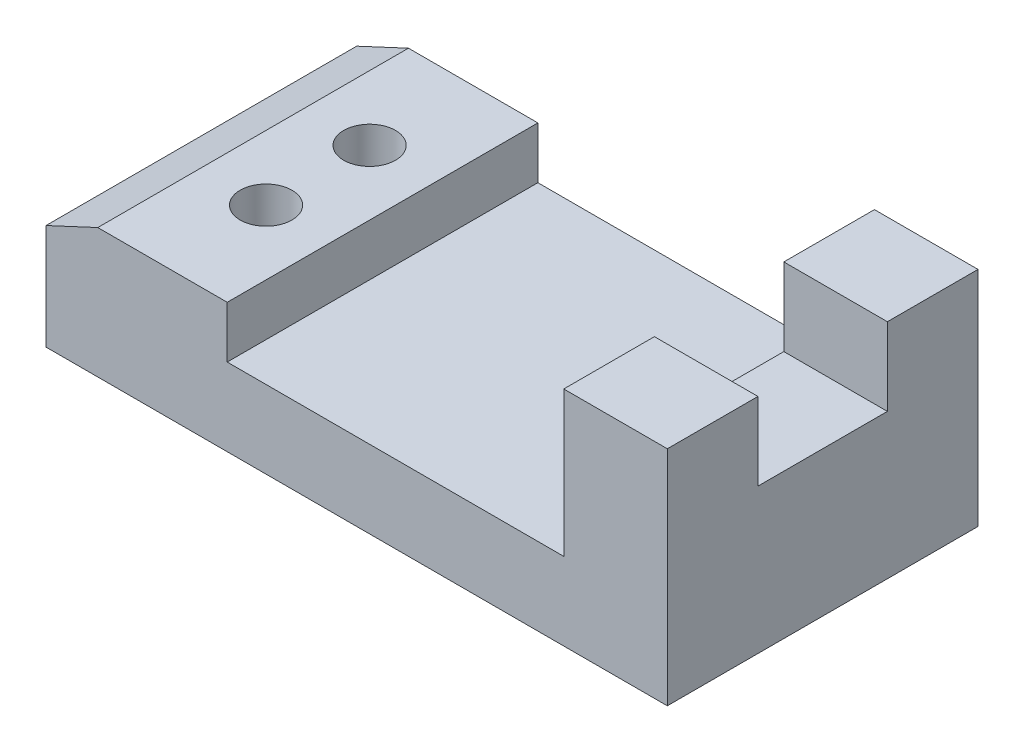
ISO-10303-21;
HEADER;
FILE_DESCRIPTION(('STEP AP214'),'2;1');
FILE_NAME('part.step','',(''),(''),'','','');
FILE_SCHEMA(('AUTOMOTIVE_DESIGN { 1 0 10303 214 1 1 1 1 }'));
ENDSEC;
DATA;
#1=APPLICATION_CONTEXT('core data for automotive mechanical design processes');
#2=APPLICATION_PROTOCOL_DEFINITION('international standard','automotive_design',2000,#1);
#3=PRODUCT_CONTEXT('',#1,'mechanical');
#4=PRODUCT('Part','Part','',(#3));
#5=PRODUCT_RELATED_PRODUCT_CATEGORY('part','',(#4));
#6=PRODUCT_DEFINITION_FORMATION('','',#4);
#7=PRODUCT_DEFINITION_CONTEXT('part definition',#1,'design');
#8=PRODUCT_DEFINITION('design','',#6,#7);
#9=PRODUCT_DEFINITION_SHAPE('','',#8);
#10=(LENGTH_UNIT() NAMED_UNIT(*) SI_UNIT(.MILLI.,.METRE.));
#11=(NAMED_UNIT(*) PLANE_ANGLE_UNIT() SI_UNIT($,.RADIAN.));
#12=(NAMED_UNIT(*) SI_UNIT($,.STERADIAN.) SOLID_ANGLE_UNIT());
#13=UNCERTAINTY_MEASURE_WITH_UNIT(LENGTH_MEASURE(1.E-05),#10,'distance_accuracy_value','');
#14=(GEOMETRIC_REPRESENTATION_CONTEXT(3) GLOBAL_UNCERTAINTY_ASSIGNED_CONTEXT((#13)) GLOBAL_UNIT_ASSIGNED_CONTEXT((#10,
#11,#12)) REPRESENTATION_CONTEXT('',''));
#15=CARTESIAN_POINT('',(0.,0.,0.));
#16=DIRECTION('',(0.,0.,1.));
#17=DIRECTION('',(1.,0.,0.));
#18=AXIS2_PLACEMENT_3D('',#15,#16,#17);
#19=CARTESIAN_POINT('',(120.,43.,60.));
#20=DIRECTION('',(0.,-1.,0.));
#21=DIRECTION('',(0.,0.,-1.));
#22=AXIS2_PLACEMENT_3D('',#19,#20,#21);
#23=PLANE('',#22);
#24=DIRECTION('',(0.,0.,-1.));
#25=VECTOR('',#24,1.);
#26=CARTESIAN_POINT('',(120.,43.,60.));
#27=LINE('',#26,#25);
#28=CARTESIAN_POINT('',(120.,43.,60.));
#29=VERTEX_POINT('',#28);
#30=CARTESIAN_POINT('',(120.,43.,42.5));
#31=VERTEX_POINT('',#30);
#32=EDGE_CURVE('E184',#29,#31,#27,.T.);
#33=ORIENTED_EDGE('',*,*,#32,.T.);
#34=DIRECTION('',(1.,0.,0.));
#35=VECTOR('',#34,1.);
#36=CARTESIAN_POINT('',(120.,43.,42.5));
#37=LINE('',#36,#35);
#38=CARTESIAN_POINT('',(100.,43.,42.5));
#39=VERTEX_POINT('',#38);
#40=EDGE_CURVE('E190',#39,#31,#37,.T.);
#41=ORIENTED_EDGE('',*,*,#40,.F.);
#42=DIRECTION('',(0.,0.,-1.));
#43=VECTOR('',#42,1.);
#44=CARTESIAN_POINT('',(100.,43.,60.));
#45=LINE('',#44,#43);
#46=CARTESIAN_POINT('',(100.,43.,60.));
#47=VERTEX_POINT('',#46);
#48=EDGE_CURVE('E180',#47,#39,#45,.T.);
#49=ORIENTED_EDGE('',*,*,#48,.F.);
#50=DIRECTION('',(-1.,0.,0.));
#51=VECTOR('',#50,1.);
#52=CARTESIAN_POINT('',(120.,43.,60.));
#53=LINE('',#52,#51);
#54=EDGE_CURVE('E230',#29,#47,#53,.T.);
#55=ORIENTED_EDGE('',*,*,#54,.F.);
#56=EDGE_LOOP('',(#33,#41,#49,#55));
#57=FACE_BOUND('',#56,.T.);
#58=ADVANCED_FACE('F35',(#57),#23,.F.);
#59=CARTESIAN_POINT('',(0.,0.,60.));
#60=DIRECTION('',(1.,0.,0.));
#61=DIRECTION('',(0.,0.,-1.));
#62=AXIS2_PLACEMENT_3D('',#59,#60,#61);
#63=PLANE('',#62);
#64=DIRECTION('',(0.,-1.,0.));
#65=VECTOR('',#64,1.);
#66=CARTESIAN_POINT('',(0.,0.,0.));
#67=LINE('',#66,#65);
#68=CARTESIAN_POINT('',(0.,20.3369234184501,0.));
#69=VERTEX_POINT('',#68);
#70=CARTESIAN_POINT('',(0.,0.,0.));
#71=VERTEX_POINT('',#70);
#72=EDGE_CURVE('E152',#69,#71,#67,.T.);
#73=ORIENTED_EDGE('',*,*,#72,.T.);
#74=DIRECTION('',(0.,0.,-1.));
#75=VECTOR('',#74,1.);
#76=CARTESIAN_POINT('',(0.,0.,60.));
#77=LINE('',#76,#75);
#78=CARTESIAN_POINT('',(0.,0.,60.));
#79=VERTEX_POINT('',#78);
#80=EDGE_CURVE('E11',#79,#71,#77,.T.);
#81=ORIENTED_EDGE('',*,*,#80,.F.);
#82=DIRECTION('',(0.,-1.,0.));
#83=VECTOR('',#82,1.);
#84=CARTESIAN_POINT('',(0.,0.,60.));
#85=LINE('',#84,#83);
#86=CARTESIAN_POINT('',(0.,20.3369234184501,60.));
#87=VERTEX_POINT('',#86);
#88=EDGE_CURVE('E172',#87,#79,#85,.T.);
#89=ORIENTED_EDGE('',*,*,#88,.F.);
#90=DIRECTION('',(0.,0.,-1.));
#91=VECTOR('',#90,1.);
#92=CARTESIAN_POINT('',(0.,20.3369234184501,60.));
#93=LINE('',#92,#91);
#94=EDGE_CURVE('E148',#87,#69,#93,.T.);
#95=ORIENTED_EDGE('',*,*,#94,.T.);
#96=EDGE_LOOP('',(#73,#81,#89,#95));
#97=FACE_BOUND('',#96,.T.);
#98=ADVANCED_FACE('F37',(#97),#63,.F.);
#99=CARTESIAN_POINT('',(0.,0.,60.));
#100=DIRECTION('',(0.,1.,0.));
#101=DIRECTION('',(0.,0.,1.));
#102=AXIS2_PLACEMENT_3D('',#99,#100,#101);
#103=PLANE('',#102);
#104=CARTESIAN_POINT('',(22.5,0.,20.));
#105=DIRECTION('',(0.,1.,0.));
#106=DIRECTION('',(-1.,0.,0.));
#107=AXIS2_PLACEMENT_3D('',#104,#105,#106);
#108=CIRCLE('',#107,5.);
#109=CARTESIAN_POINT('',(17.5,0.,20.));
#110=VERTEX_POINT('',#109);
#111=EDGE_CURVE('E202',#110,#110,#108,.T.);
#112=ORIENTED_EDGE('',*,*,#111,.T.);
#113=EDGE_LOOP('',(#112));
#114=FACE_BOUND('',#113,.T.);
#115=CARTESIAN_POINT('',(22.5,0.,40.));
#116=DIRECTION('',(0.,1.,0.));
#117=DIRECTION('',(-1.,0.,0.));
#118=AXIS2_PLACEMENT_3D('',#115,#116,#117);
#119=CIRCLE('',#118,5.);
#120=CARTESIAN_POINT('',(17.5,0.,40.));
#121=VERTEX_POINT('',#120);
#122=EDGE_CURVE('E191',#121,#121,#119,.T.);
#123=ORIENTED_EDGE('',*,*,#122,.T.);
#124=EDGE_LOOP('',(#123));
#125=FACE_BOUND('',#124,.T.);
#126=DIRECTION('',(1.,0.,0.));
#127=VECTOR('',#126,1.);
#128=CARTESIAN_POINT('',(0.,0.,0.));
#129=LINE('',#128,#127);
#130=CARTESIAN_POINT('',(120.,0.,0.));
#131=VERTEX_POINT('',#130);
#132=EDGE_CURVE('E155',#71,#131,#129,.T.);
#133=ORIENTED_EDGE('',*,*,#132,.T.);
#134=DIRECTION('',(0.,0.,-1.));
#135=VECTOR('',#134,1.);
#136=CARTESIAN_POINT('',(120.,0.,60.));
#137=LINE('',#136,#135);
#138=CARTESIAN_POINT('',(120.,0.,60.));
#139=VERTEX_POINT('',#138);
#140=EDGE_CURVE('E44',#139,#131,#137,.T.);
#141=ORIENTED_EDGE('',*,*,#140,.F.);
#142=DIRECTION('',(1.,0.,0.));
#143=VECTOR('',#142,1.);
#144=CARTESIAN_POINT('',(0.,0.,60.));
#145=LINE('',#144,#143);
#146=EDGE_CURVE('E105',#79,#139,#145,.T.);
#147=ORIENTED_EDGE('',*,*,#146,.F.);
#148=ORIENTED_EDGE('',*,*,#80,.T.);
#149=EDGE_LOOP('',(#133,#141,#147,#148));
#150=FACE_BOUND('',#149,.T.);
#151=ADVANCED_FACE('F252',(#114,#125,#150),#103,.F.);
#152=CARTESIAN_POINT('',(120.,0.,60.));
#153=DIRECTION('',(-1.,0.,0.));
#154=DIRECTION('',(0.,0.,1.));
#155=AXIS2_PLACEMENT_3D('',#152,#153,#154);
#156=PLANE('',#155);
#157=DIRECTION('',(0.,0.,-1.));
#158=VECTOR('',#157,1.);
#159=CARTESIAN_POINT('',(120.,28.,17.5));
#160=LINE('',#159,#158);
#161=CARTESIAN_POINT('',(120.,28.,42.5));
#162=VERTEX_POINT('',#161);
#163=CARTESIAN_POINT('',(120.,28.,17.5));
#164=VERTEX_POINT('',#163);
#165=EDGE_CURVE('E208',#162,#164,#160,.T.);
#166=ORIENTED_EDGE('',*,*,#165,.F.);
#167=DIRECTION('',(0.,1.,0.));
#168=VECTOR('',#167,1.);
#169=CARTESIAN_POINT('',(120.,28.,42.5));
#170=LINE('',#169,#168);
#171=EDGE_CURVE('E212',#162,#31,#170,.T.);
#172=ORIENTED_EDGE('',*,*,#171,.T.);
#173=ORIENTED_EDGE('',*,*,#32,.F.);
#174=DIRECTION('',(0.,1.,0.));
#175=VECTOR('',#174,1.);
#176=CARTESIAN_POINT('',(120.,0.,60.));
#177=LINE('',#176,#175);
#178=EDGE_CURVE('E228',#139,#29,#177,.T.);
#179=ORIENTED_EDGE('',*,*,#178,.F.);
#180=ORIENTED_EDGE('',*,*,#140,.T.);
#181=DIRECTION('',(0.,1.,0.));
#182=VECTOR('',#181,1.);
#183=CARTESIAN_POINT('',(120.,0.,0.));
#184=LINE('',#183,#182);
#185=CARTESIAN_POINT('',(120.,43.,0.));
#186=VERTEX_POINT('',#185);
#187=EDGE_CURVE('E158',#131,#186,#184,.T.);
#188=ORIENTED_EDGE('',*,*,#187,.T.);
#189=CARTESIAN_POINT('',(120.,43.,17.5));
#190=VERTEX_POINT('',#189);
#191=EDGE_CURVE('E183',#190,#186,#27,.T.);
#192=ORIENTED_EDGE('',*,*,#191,.F.);
#193=DIRECTION('',(0.,1.,0.));
#194=VECTOR('',#193,1.);
#195=CARTESIAN_POINT('',(120.,28.,17.5));
#196=LINE('',#195,#194);
#197=EDGE_CURVE('E221',#164,#190,#196,.T.);
#198=ORIENTED_EDGE('',*,*,#197,.F.);
#199=EDGE_LOOP('',(#166,#172,#173,#179,#180,#188,#192,#198));
#200=FACE_BOUND('',#199,.T.);
#201=ADVANCED_FACE('F256',(#200),#156,.F.);
#202=CARTESIAN_POINT('',(100.,43.,17.5));
#203=VERTEX_POINT('',#202);
#204=CARTESIAN_POINT('',(100.,43.,0.));
#205=VERTEX_POINT('',#204);
#206=EDGE_CURVE('E179',#203,#205,#45,.T.);
#207=ORIENTED_EDGE('',*,*,#206,.F.);
#208=DIRECTION('',(-1.,0.,0.));
#209=VECTOR('',#208,1.);
#210=CARTESIAN_POINT('',(100.,43.,17.5));
#211=LINE('',#210,#209);
#212=EDGE_CURVE('E195',#190,#203,#211,.T.);
#213=ORIENTED_EDGE('',*,*,#212,.F.);
#214=ORIENTED_EDGE('',*,*,#191,.T.);
#215=DIRECTION('',(-1.,0.,0.));
#216=VECTOR('',#215,1.);
#217=CARTESIAN_POINT('',(120.,43.,0.));
#218=LINE('',#217,#216);
#219=EDGE_CURVE('E161',#186,#205,#218,.T.);
#220=ORIENTED_EDGE('',*,*,#219,.T.);
#221=EDGE_LOOP('',(#207,#213,#214,#220));
#222=FACE_BOUND('',#221,.T.);
#223=ADVANCED_FACE('F283',(#222),#23,.F.);
#224=CARTESIAN_POINT('',(100.,43.,60.));
#225=DIRECTION('',(1.,0.,0.));
#226=DIRECTION('',(0.,0.,-1.));
#227=AXIS2_PLACEMENT_3D('',#224,#225,#226);
#228=PLANE('',#227);
#229=ORIENTED_EDGE('',*,*,#48,.T.);
#230=DIRECTION('',(0.,1.,0.));
#231=VECTOR('',#230,1.);
#232=CARTESIAN_POINT('',(100.,28.,42.5));
#233=LINE('',#232,#231);
#234=CARTESIAN_POINT('',(100.,28.,42.5));
#235=VERTEX_POINT('',#234);
#236=EDGE_CURVE('E156',#235,#39,#233,.T.);
#237=ORIENTED_EDGE('',*,*,#236,.F.);
#238=DIRECTION('',(0.,0.,1.));
#239=VECTOR('',#238,1.);
#240=CARTESIAN_POINT('',(100.,28.,42.5));
#241=LINE('',#240,#239);
#242=CARTESIAN_POINT('',(100.,28.,17.5));
#243=VERTEX_POINT('',#242);
#244=EDGE_CURVE('E211',#243,#235,#241,.T.);
#245=ORIENTED_EDGE('',*,*,#244,.F.);
#246=DIRECTION('',(0.,1.,0.));
#247=VECTOR('',#246,1.);
#248=CARTESIAN_POINT('',(100.,28.,17.5));
#249=LINE('',#248,#247);
#250=EDGE_CURVE('E218',#243,#203,#249,.T.);
#251=ORIENTED_EDGE('',*,*,#250,.T.);
#252=ORIENTED_EDGE('',*,*,#206,.T.);
#253=DIRECTION('',(0.,-1.,0.));
#254=VECTOR('',#253,1.);
#255=CARTESIAN_POINT('',(100.,43.,0.));
#256=LINE('',#255,#254);
#257=CARTESIAN_POINT('',(100.,15.,0.));
#258=VERTEX_POINT('',#257);
#259=EDGE_CURVE('E164',#205,#258,#256,.T.);
#260=ORIENTED_EDGE('',*,*,#259,.T.);
#261=DIRECTION('',(0.,0.,-1.));
#262=VECTOR('',#261,1.);
#263=CARTESIAN_POINT('',(100.,15.,60.));
#264=LINE('',#263,#262);
#265=CARTESIAN_POINT('',(100.,15.,60.));
#266=VERTEX_POINT('',#265);
#267=EDGE_CURVE('E176',#266,#258,#264,.T.);
#268=ORIENTED_EDGE('',*,*,#267,.F.);
#269=DIRECTION('',(0.,-1.,0.));
#270=VECTOR('',#269,1.);
#271=CARTESIAN_POINT('',(100.,43.,60.));
#272=LINE('',#271,#270);
#273=EDGE_CURVE('E232',#47,#266,#272,.T.);
#274=ORIENTED_EDGE('',*,*,#273,.F.);
#275=EDGE_LOOP('',(#229,#237,#245,#251,#252,#260,#268,#274));
#276=FACE_BOUND('',#275,.T.);
#277=ADVANCED_FACE('F238',(#276),#228,.F.);
#278=CARTESIAN_POINT('',(100.,15.,60.));
#279=DIRECTION('',(0.,-1.,0.));
#280=DIRECTION('',(1.,0.,0.));
#281=AXIS2_PLACEMENT_3D('',#278,#279,#280);
#282=PLANE('',#281);
#283=DIRECTION('',(-1.,0.,0.));
#284=VECTOR('',#283,1.);
#285=CARTESIAN_POINT('',(100.,15.,0.));
#286=LINE('',#285,#284);
#287=CARTESIAN_POINT('',(35.,15.,0.));
#288=VERTEX_POINT('',#287);
#289=EDGE_CURVE('E166',#258,#288,#286,.T.);
#290=ORIENTED_EDGE('',*,*,#289,.T.);
#291=DIRECTION('',(0.,0.,-1.));
#292=VECTOR('',#291,1.);
#293=CARTESIAN_POINT('',(35.,15.,60.));
#294=LINE('',#293,#292);
#295=CARTESIAN_POINT('',(35.,15.,60.));
#296=VERTEX_POINT('',#295);
#297=EDGE_CURVE('E143',#296,#288,#294,.T.);
#298=ORIENTED_EDGE('',*,*,#297,.F.);
#299=DIRECTION('',(-1.,0.,0.));
#300=VECTOR('',#299,1.);
#301=CARTESIAN_POINT('',(100.,15.,60.));
#302=LINE('',#301,#300);
#303=EDGE_CURVE('E131',#266,#296,#302,.T.);
#304=ORIENTED_EDGE('',*,*,#303,.F.);
#305=ORIENTED_EDGE('',*,*,#267,.T.);
#306=EDGE_LOOP('',(#290,#298,#304,#305));
#307=FACE_BOUND('',#306,.T.);
#308=ADVANCED_FACE('F242',(#307),#282,.F.);
#309=CARTESIAN_POINT('',(35.,15.,60.));
#310=DIRECTION('',(-1.,0.,0.));
#311=DIRECTION('',(0.,0.,1.));
#312=AXIS2_PLACEMENT_3D('',#309,#310,#311);
#313=PLANE('',#312);
#314=DIRECTION('',(0.,1.,0.));
#315=VECTOR('',#314,1.);
#316=CARTESIAN_POINT('',(35.,15.,0.));
#317=LINE('',#316,#315);
#318=CARTESIAN_POINT('',(35.,25.,0.));
#319=VERTEX_POINT('',#318);
#320=EDGE_CURVE('E140',#288,#319,#317,.T.);
#321=ORIENTED_EDGE('',*,*,#320,.T.);
#322=DIRECTION('',(0.,0.,-1.));
#323=VECTOR('',#322,1.);
#324=CARTESIAN_POINT('',(35.,25.,60.));
#325=LINE('',#324,#323);
#326=CARTESIAN_POINT('',(35.,25.,60.));
#327=VERTEX_POINT('',#326);
#328=EDGE_CURVE('E137',#327,#319,#325,.T.);
#329=ORIENTED_EDGE('',*,*,#328,.F.);
#330=DIRECTION('',(0.,1.,0.));
#331=VECTOR('',#330,1.);
#332=CARTESIAN_POINT('',(35.,15.,60.));
#333=LINE('',#332,#331);
#334=EDGE_CURVE('E124',#296,#327,#333,.T.);
#335=ORIENTED_EDGE('',*,*,#334,.F.);
#336=ORIENTED_EDGE('',*,*,#297,.T.);
#337=EDGE_LOOP('',(#321,#329,#335,#336));
#338=FACE_BOUND('',#337,.T.);
#339=ADVANCED_FACE('F138',(#338),#313,.F.);
#340=CARTESIAN_POINT('',(35.,25.,60.));
#341=DIRECTION('',(0.,-1.,0.));
#342=DIRECTION('',(1.,0.,0.));
#343=AXIS2_PLACEMENT_3D('',#340,#341,#342);
#344=PLANE('',#343);
#345=CARTESIAN_POINT('',(22.5,25.,20.));
#346=DIRECTION('',(0.,-1.,0.));
#347=DIRECTION('',(1.,0.,0.));
#348=AXIS2_PLACEMENT_3D('',#345,#346,#347);
#349=CIRCLE('',#348,5.);
#350=CARTESIAN_POINT('',(27.5,25.,20.));
#351=VERTEX_POINT('',#350);
#352=EDGE_CURVE('E39',#351,#351,#349,.T.);
#353=ORIENTED_EDGE('',*,*,#352,.T.);
#354=EDGE_LOOP('',(#353));
#355=FACE_BOUND('',#354,.T.);
#356=CARTESIAN_POINT('',(22.5,25.,40.));
#357=DIRECTION('',(0.,-1.,0.));
#358=DIRECTION('',(1.,0.,0.));
#359=AXIS2_PLACEMENT_3D('',#356,#357,#358);
#360=CIRCLE('',#359,5.);
#361=CARTESIAN_POINT('',(27.5,25.,40.));
#362=VERTEX_POINT('',#361);
#363=EDGE_CURVE('E188',#362,#362,#360,.T.);
#364=ORIENTED_EDGE('',*,*,#363,.T.);
#365=EDGE_LOOP('',(#364));
#366=FACE_BOUND('',#365,.T.);
#367=DIRECTION('',(-1.,0.,0.));
#368=VECTOR('',#367,1.);
#369=CARTESIAN_POINT('',(35.,25.,0.));
#370=LINE('',#369,#368);
#371=CARTESIAN_POINT('',(10.,25.,0.));
#372=VERTEX_POINT('',#371);
#373=EDGE_CURVE('E169',#319,#372,#370,.T.);
#374=ORIENTED_EDGE('',*,*,#373,.T.);
#375=DIRECTION('',(0.,0.,-1.));
#376=VECTOR('',#375,1.);
#377=CARTESIAN_POINT('',(10.,25.,60.));
#378=LINE('',#377,#376);
#379=CARTESIAN_POINT('',(10.,25.,60.));
#380=VERTEX_POINT('',#379);
#381=EDGE_CURVE('E144',#380,#372,#378,.T.);
#382=ORIENTED_EDGE('',*,*,#381,.F.);
#383=DIRECTION('',(-1.,0.,0.));
#384=VECTOR('',#383,1.);
#385=CARTESIAN_POINT('',(35.,25.,60.));
#386=LINE('',#385,#384);
#387=EDGE_CURVE('E128',#327,#380,#386,.T.);
#388=ORIENTED_EDGE('',*,*,#387,.F.);
#389=ORIENTED_EDGE('',*,*,#328,.T.);
#390=EDGE_LOOP('',(#374,#382,#388,#389));
#391=FACE_BOUND('',#390,.T.);
#392=ADVANCED_FACE('F146',(#355,#366,#391),#344,.F.);
#393=CARTESIAN_POINT('',(0.,20.3369234184501,60.));
#394=DIRECTION('',(0.422618261740694,-0.906307787036653,0.));
#395=DIRECTION('',(0.906307787036653,0.422618261740694,0.));
#396=AXIS2_PLACEMENT_3D('',#393,#394,#395);
#397=PLANE('',#396);
#398=DIRECTION('',(-0.906307787036653,-0.422618261740694,0.));
#399=VECTOR('',#398,1.);
#400=CARTESIAN_POINT('',(0.,20.3369234184501,0.));
#401=LINE('',#400,#399);
#402=EDGE_CURVE('E97',#372,#69,#401,.T.);
#403=ORIENTED_EDGE('',*,*,#402,.T.);
#404=ORIENTED_EDGE('',*,*,#94,.F.);
#405=DIRECTION('',(-0.906307787036653,-0.422618261740694,0.));
#406=VECTOR('',#405,1.);
#407=CARTESIAN_POINT('',(0.,20.3369234184501,60.));
#408=LINE('',#407,#406);
#409=EDGE_CURVE('E61',#380,#87,#408,.T.);
#410=ORIENTED_EDGE('',*,*,#409,.F.);
#411=ORIENTED_EDGE('',*,*,#381,.T.);
#412=EDGE_LOOP('',(#403,#404,#410,#411));
#413=FACE_BOUND('',#412,.T.);
#414=ADVANCED_FACE('F246',(#413),#397,.F.);
#415=CARTESIAN_POINT('',(0.,0.,60.));
#416=DIRECTION('',(0.,0.,1.));
#417=DIRECTION('',(1.,0.,0.));
#418=AXIS2_PLACEMENT_3D('',#415,#416,#417);
#419=PLANE('',#418);
#420=ORIENTED_EDGE('',*,*,#88,.T.);
#421=ORIENTED_EDGE('',*,*,#146,.T.);
#422=ORIENTED_EDGE('',*,*,#178,.T.);
#423=ORIENTED_EDGE('',*,*,#54,.T.);
#424=ORIENTED_EDGE('',*,*,#273,.T.);
#425=ORIENTED_EDGE('',*,*,#303,.T.);
#426=ORIENTED_EDGE('',*,*,#334,.T.);
#427=ORIENTED_EDGE('',*,*,#387,.T.);
#428=ORIENTED_EDGE('',*,*,#409,.T.);
#429=EDGE_LOOP('',(#420,#421,#422,#423,#424,#425,#426,#427,#428));
#430=FACE_BOUND('',#429,.T.);
#431=ADVANCED_FACE('F126',(#430),#419,.T.);
#432=CARTESIAN_POINT('',(0.,0.,0.));
#433=DIRECTION('',(0.,0.,1.));
#434=DIRECTION('',(1.,0.,0.));
#435=AXIS2_PLACEMENT_3D('',#432,#433,#434);
#436=PLANE('',#435);
#437=ORIENTED_EDGE('',*,*,#72,.F.);
#438=ORIENTED_EDGE('',*,*,#402,.F.);
#439=ORIENTED_EDGE('',*,*,#373,.F.);
#440=ORIENTED_EDGE('',*,*,#320,.F.);
#441=ORIENTED_EDGE('',*,*,#289,.F.);
#442=ORIENTED_EDGE('',*,*,#259,.F.);
#443=ORIENTED_EDGE('',*,*,#219,.F.);
#444=ORIENTED_EDGE('',*,*,#187,.F.);
#445=ORIENTED_EDGE('',*,*,#132,.F.);
#446=EDGE_LOOP('',(#437,#438,#439,#440,#441,#442,#443,#444,#445));
#447=FACE_BOUND('',#446,.T.);
#448=ADVANCED_FACE('F245',(#447),#436,.F.);
#449=CARTESIAN_POINT('',(120.,28.,42.5));
#450=DIRECTION('',(0.,0.,1.));
#451=DIRECTION('',(1.,0.,0.));
#452=AXIS2_PLACEMENT_3D('',#449,#450,#451);
#453=PLANE('',#452);
#454=ORIENTED_EDGE('',*,*,#40,.T.);
#455=ORIENTED_EDGE('',*,*,#171,.F.);
#456=DIRECTION('',(1.,0.,0.));
#457=VECTOR('',#456,1.);
#458=CARTESIAN_POINT('',(120.,28.,42.5));
#459=LINE('',#458,#457);
#460=EDGE_CURVE('E205',#235,#162,#459,.T.);
#461=ORIENTED_EDGE('',*,*,#460,.F.);
#462=ORIENTED_EDGE('',*,*,#236,.T.);
#463=EDGE_LOOP('',(#454,#455,#461,#462));
#464=FACE_BOUND('',#463,.T.);
#465=ADVANCED_FACE('F354',(#464),#453,.F.);
#466=CARTESIAN_POINT('',(100.,28.,17.5));
#467=DIRECTION('',(0.,0.,-1.));
#468=DIRECTION('',(-1.,0.,0.));
#469=AXIS2_PLACEMENT_3D('',#466,#467,#468);
#470=PLANE('',#469);
#471=ORIENTED_EDGE('',*,*,#212,.T.);
#472=ORIENTED_EDGE('',*,*,#250,.F.);
#473=DIRECTION('',(-1.,0.,0.));
#474=VECTOR('',#473,1.);
#475=CARTESIAN_POINT('',(100.,28.,17.5));
#476=LINE('',#475,#474);
#477=EDGE_CURVE('E52',#164,#243,#476,.T.);
#478=ORIENTED_EDGE('',*,*,#477,.F.);
#479=ORIENTED_EDGE('',*,*,#197,.T.);
#480=EDGE_LOOP('',(#471,#472,#478,#479));
#481=FACE_BOUND('',#480,.T.);
#482=ADVANCED_FACE('F276',(#481),#470,.F.);
#483=CARTESIAN_POINT('',(0.,28.,0.));
#484=DIRECTION('',(0.,-1.,0.));
#485=DIRECTION('',(0.,0.,-1.));
#486=AXIS2_PLACEMENT_3D('',#483,#484,#485);
#487=PLANE('',#486);
#488=ORIENTED_EDGE('',*,*,#460,.T.);
#489=ORIENTED_EDGE('',*,*,#165,.T.);
#490=ORIENTED_EDGE('',*,*,#477,.T.);
#491=ORIENTED_EDGE('',*,*,#244,.T.);
#492=EDGE_LOOP('',(#488,#489,#490,#491));
#493=FACE_BOUND('',#492,.T.);
#494=ADVANCED_FACE('F278',(#493),#487,.F.);
#495=CARTESIAN_POINT('',(22.5,0.,40.));
#496=DIRECTION('',(0.,1.,0.));
#497=DIRECTION('',(-1.,0.,0.));
#498=AXIS2_PLACEMENT_3D('',#495,#496,#497);
#499=CYLINDRICAL_SURFACE('',#498,5.);
#500=ORIENTED_EDGE('',*,*,#122,.F.);
#501=EDGE_LOOP('',(#500));
#502=FACE_BOUND('',#501,.T.);
#503=ORIENTED_EDGE('',*,*,#363,.F.);
#504=EDGE_LOOP('',(#503));
#505=FACE_BOUND('',#504,.T.);
#506=ADVANCED_FACE('F308',(#502,#505),#499,.F.);
#507=CARTESIAN_POINT('',(22.5,0.,20.));
#508=DIRECTION('',(0.,1.,0.));
#509=DIRECTION('',(-1.,0.,0.));
#510=AXIS2_PLACEMENT_3D('',#507,#508,#509);
#511=CYLINDRICAL_SURFACE('',#510,5.);
#512=ORIENTED_EDGE('',*,*,#111,.F.);
#513=EDGE_LOOP('',(#512));
#514=FACE_BOUND('',#513,.T.);
#515=ORIENTED_EDGE('',*,*,#352,.F.);
#516=EDGE_LOOP('',(#515));
#517=FACE_BOUND('',#516,.T.);
#518=ADVANCED_FACE('F305',(#514,#517),#511,.F.);
#519=CLOSED_SHELL('',(#58,#98,#151,#201,#223,#277,#308,#339,#392,#414,#431,#448,#465,#482,#494,
#506,#518));
#520=MANIFOLD_SOLID_BREP('B2',#519);
#521=ADVANCED_BREP_SHAPE_REPRESENTATION('',(#18,#520),#14);
#522=SHAPE_DEFINITION_REPRESENTATION(#9,#521);
ENDSEC;
END-ISO-10303-21;
